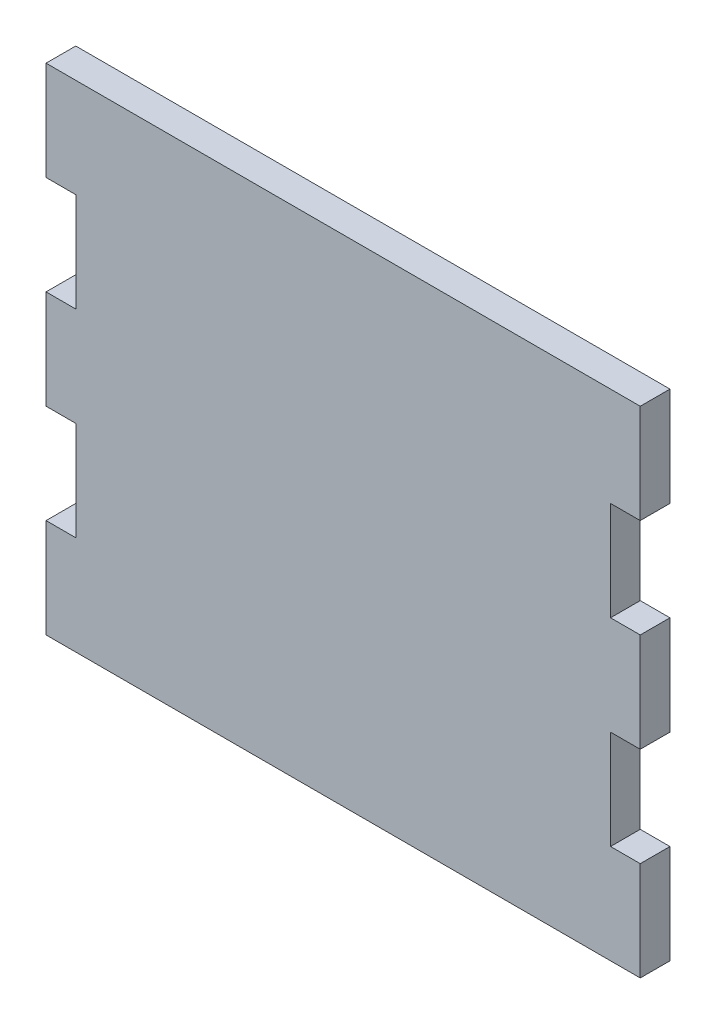
ISO-10303-21;
HEADER;
FILE_DESCRIPTION(('STEP AP214'),'2;1');
FILE_NAME('part.step','',(''),(''),'','','');
FILE_SCHEMA(('AUTOMOTIVE_DESIGN { 1 0 10303 214 1 1 1 1 }'));
ENDSEC;
DATA;
#1=APPLICATION_CONTEXT('core data for automotive mechanical design processes');
#2=APPLICATION_PROTOCOL_DEFINITION('international standard','automotive_design',2000,#1);
#3=PRODUCT_CONTEXT('',#1,'mechanical');
#4=PRODUCT('Part','Part','',(#3));
#5=PRODUCT_RELATED_PRODUCT_CATEGORY('part','',(#4));
#6=PRODUCT_DEFINITION_FORMATION('','',#4);
#7=PRODUCT_DEFINITION_CONTEXT('part definition',#1,'design');
#8=PRODUCT_DEFINITION('design','',#6,#7);
#9=PRODUCT_DEFINITION_SHAPE('','',#8);
#10=(LENGTH_UNIT() NAMED_UNIT(*) SI_UNIT(.MILLI.,.METRE.));
#11=(NAMED_UNIT(*) PLANE_ANGLE_UNIT() SI_UNIT($,.RADIAN.));
#12=(NAMED_UNIT(*) SI_UNIT($,.STERADIAN.) SOLID_ANGLE_UNIT());
#13=UNCERTAINTY_MEASURE_WITH_UNIT(LENGTH_MEASURE(1.E-05),#10,'distance_accuracy_value','');
#14=(GEOMETRIC_REPRESENTATION_CONTEXT(3) GLOBAL_UNCERTAINTY_ASSIGNED_CONTEXT((#13)) GLOBAL_UNIT_ASSIGNED_CONTEXT((#10,
#11,#12)) REPRESENTATION_CONTEXT('',''));
#15=CARTESIAN_POINT('',(0.,0.,0.));
#16=DIRECTION('',(0.,0.,1.));
#17=DIRECTION('',(1.,0.,0.));
#18=AXIS2_PLACEMENT_3D('',#15,#16,#17);
#19=CARTESIAN_POINT('',(-30.,0.,3.));
#20=DIRECTION('',(-1.,0.,0.));
#21=DIRECTION('',(0.,0.,1.));
#22=AXIS2_PLACEMENT_3D('',#19,#20,#21);
#23=PLANE('',#22);
#24=DIRECTION('',(0.,1.,0.));
#25=VECTOR('',#24,1.);
#26=CARTESIAN_POINT('',(-30.,0.,0.));
#27=LINE('',#26,#25);
#28=CARTESIAN_POINT('',(-30.,9.99999999999998,0.));
#29=VERTEX_POINT('',#28);
#30=CARTESIAN_POINT('',(-30.,20.,0.));
#31=VERTEX_POINT('',#30);
#32=EDGE_CURVE('E201',#29,#31,#27,.T.);
#33=ORIENTED_EDGE('',*,*,#32,.F.);
#34=DIRECTION('',(0.,0.,-1.));
#35=VECTOR('',#34,1.);
#36=CARTESIAN_POINT('',(-30.,9.99999999999998,3.));
#37=LINE('',#36,#35);
#38=CARTESIAN_POINT('',(-30.,9.99999999999998,3.));
#39=VERTEX_POINT('',#38);
#40=EDGE_CURVE('E11',#39,#29,#37,.T.);
#41=ORIENTED_EDGE('',*,*,#40,.F.);
#42=DIRECTION('',(0.,1.,0.));
#43=VECTOR('',#42,1.);
#44=CARTESIAN_POINT('',(-30.,0.,3.));
#45=LINE('',#44,#43);
#46=CARTESIAN_POINT('',(-30.,20.,3.));
#47=VERTEX_POINT('',#46);
#48=EDGE_CURVE('E247',#39,#47,#45,.T.);
#49=ORIENTED_EDGE('',*,*,#48,.T.);
#50=DIRECTION('',(0.,0.,-1.));
#51=VECTOR('',#50,1.);
#52=CARTESIAN_POINT('',(-30.,20.,3.));
#53=LINE('',#52,#51);
#54=EDGE_CURVE('E52',#47,#31,#53,.T.);
#55=ORIENTED_EDGE('',*,*,#54,.T.);
#56=EDGE_LOOP('',(#33,#41,#49,#55));
#57=FACE_BOUND('',#56,.T.);
#58=ADVANCED_FACE('F35',(#57),#23,.T.);
#59=CARTESIAN_POINT('',(0.,9.99999999999998,3.));
#60=DIRECTION('',(0.,1.,0.));
#61=DIRECTION('',(0.,0.,1.));
#62=AXIS2_PLACEMENT_3D('',#59,#60,#61);
#63=PLANE('',#62);
#64=DIRECTION('',(1.,0.,0.));
#65=VECTOR('',#64,1.);
#66=CARTESIAN_POINT('',(0.,9.99999999999998,0.));
#67=LINE('',#66,#65);
#68=CARTESIAN_POINT('',(-27.,9.99999999999998,0.));
#69=VERTEX_POINT('',#68);
#70=EDGE_CURVE('E203',#29,#69,#67,.T.);
#71=ORIENTED_EDGE('',*,*,#70,.T.);
#72=DIRECTION('',(0.,0.,-1.));
#73=VECTOR('',#72,1.);
#74=CARTESIAN_POINT('',(-27.,9.99999999999998,3.));
#75=LINE('',#74,#73);
#76=CARTESIAN_POINT('',(-27.,9.99999999999998,3.));
#77=VERTEX_POINT('',#76);
#78=EDGE_CURVE('E44',#77,#69,#75,.T.);
#79=ORIENTED_EDGE('',*,*,#78,.F.);
#80=DIRECTION('',(1.,0.,0.));
#81=VECTOR('',#80,1.);
#82=CARTESIAN_POINT('',(0.,9.99999999999998,3.));
#83=LINE('',#82,#81);
#84=EDGE_CURVE('E310',#39,#77,#83,.T.);
#85=ORIENTED_EDGE('',*,*,#84,.F.);
#86=ORIENTED_EDGE('',*,*,#40,.T.);
#87=EDGE_LOOP('',(#71,#79,#85,#86));
#88=FACE_BOUND('',#87,.T.);
#89=ADVANCED_FACE('F37',(#88),#63,.F.);
#90=CARTESIAN_POINT('',(-27.,0.,3.));
#91=DIRECTION('',(1.,0.,0.));
#92=DIRECTION('',(0.,1.,0.));
#93=AXIS2_PLACEMENT_3D('',#90,#91,#92);
#94=PLANE('',#93);
#95=DIRECTION('',(0.,-1.,0.));
#96=VECTOR('',#95,1.);
#97=CARTESIAN_POINT('',(-27.,0.,0.));
#98=LINE('',#97,#96);
#99=CARTESIAN_POINT('',(-27.,0.,0.));
#100=VERTEX_POINT('',#99);
#101=EDGE_CURVE('E207',#69,#100,#98,.T.);
#102=ORIENTED_EDGE('',*,*,#101,.T.);
#103=DIRECTION('',(0.,0.,-1.));
#104=VECTOR('',#103,1.);
#105=CARTESIAN_POINT('',(-27.,0.,3.));
#106=LINE('',#105,#104);
#107=CARTESIAN_POINT('',(-27.,0.,3.));
#108=VERTEX_POINT('',#107);
#109=EDGE_CURVE('E281',#108,#100,#106,.T.);
#110=ORIENTED_EDGE('',*,*,#109,.F.);
#111=DIRECTION('',(0.,-1.,0.));
#112=VECTOR('',#111,1.);
#113=CARTESIAN_POINT('',(-27.,0.,3.));
#114=LINE('',#113,#112);
#115=EDGE_CURVE('E289',#77,#108,#114,.T.);
#116=ORIENTED_EDGE('',*,*,#115,.F.);
#117=ORIENTED_EDGE('',*,*,#78,.T.);
#118=EDGE_LOOP('',(#102,#110,#116,#117));
#119=FACE_BOUND('',#118,.T.);
#120=ADVANCED_FACE('F287',(#119),#94,.F.);
#121=CARTESIAN_POINT('',(0.,0.,3.));
#122=DIRECTION('',(0.,1.,0.));
#123=DIRECTION('',(0.,0.,1.));
#124=AXIS2_PLACEMENT_3D('',#121,#122,#123);
#125=PLANE('',#124);
#126=DIRECTION('',(1.,0.,0.));
#127=VECTOR('',#126,1.);
#128=CARTESIAN_POINT('',(0.,0.,0.));
#129=LINE('',#128,#127);
#130=CARTESIAN_POINT('',(-30.,0.,0.));
#131=VERTEX_POINT('',#130);
#132=EDGE_CURVE('E210',#131,#100,#129,.T.);
#133=ORIENTED_EDGE('',*,*,#132,.F.);
#134=DIRECTION('',(0.,0.,-1.));
#135=VECTOR('',#134,1.);
#136=CARTESIAN_POINT('',(-30.,0.,3.));
#137=LINE('',#136,#135);
#138=CARTESIAN_POINT('',(-30.,0.,3.));
#139=VERTEX_POINT('',#138);
#140=EDGE_CURVE('E279',#139,#131,#137,.T.);
#141=ORIENTED_EDGE('',*,*,#140,.F.);
#142=DIRECTION('',(1.,0.,0.));
#143=VECTOR('',#142,1.);
#144=CARTESIAN_POINT('',(0.,0.,3.));
#145=LINE('',#144,#143);
#146=EDGE_CURVE('E302',#139,#108,#145,.T.);
#147=ORIENTED_EDGE('',*,*,#146,.T.);
#148=ORIENTED_EDGE('',*,*,#109,.T.);
#149=EDGE_LOOP('',(#133,#141,#147,#148));
#150=FACE_BOUND('',#149,.T.);
#151=ADVANCED_FACE('F299',(#150),#125,.T.);
#152=CARTESIAN_POINT('',(-30.,-10.,0.));
#153=VERTEX_POINT('',#152);
#154=EDGE_CURVE('E205',#153,#131,#27,.T.);
#155=ORIENTED_EDGE('',*,*,#154,.F.);
#156=DIRECTION('',(0.,0.,-1.));
#157=VECTOR('',#156,1.);
#158=CARTESIAN_POINT('',(-30.,-10.,3.));
#159=LINE('',#158,#157);
#160=CARTESIAN_POINT('',(-30.,-10.,3.));
#161=VERTEX_POINT('',#160);
#162=EDGE_CURVE('E277',#161,#153,#159,.T.);
#163=ORIENTED_EDGE('',*,*,#162,.F.);
#164=EDGE_CURVE('E305',#161,#139,#45,.T.);
#165=ORIENTED_EDGE('',*,*,#164,.T.);
#166=ORIENTED_EDGE('',*,*,#140,.T.);
#167=EDGE_LOOP('',(#155,#163,#165,#166));
#168=FACE_BOUND('',#167,.T.);
#169=ADVANCED_FACE('F351',(#168),#23,.T.);
#170=CARTESIAN_POINT('',(0.,-10.,3.));
#171=DIRECTION('',(0.,1.,0.));
#172=DIRECTION('',(-1.,0.,0.));
#173=AXIS2_PLACEMENT_3D('',#170,#171,#172);
#174=PLANE('',#173);
#175=DIRECTION('',(1.,0.,0.));
#176=VECTOR('',#175,1.);
#177=CARTESIAN_POINT('',(0.,-10.,0.));
#178=LINE('',#177,#176);
#179=CARTESIAN_POINT('',(-27.,-10.,0.));
#180=VERTEX_POINT('',#179);
#181=EDGE_CURVE('E213',#153,#180,#178,.T.);
#182=ORIENTED_EDGE('',*,*,#181,.T.);
#183=DIRECTION('',(0.,0.,-1.));
#184=VECTOR('',#183,1.);
#185=CARTESIAN_POINT('',(-27.,-10.,3.));
#186=LINE('',#185,#184);
#187=CARTESIAN_POINT('',(-27.,-10.,3.));
#188=VERTEX_POINT('',#187);
#189=EDGE_CURVE('E274',#188,#180,#186,.T.);
#190=ORIENTED_EDGE('',*,*,#189,.F.);
#191=DIRECTION('',(1.,0.,0.));
#192=VECTOR('',#191,1.);
#193=CARTESIAN_POINT('',(0.,-10.,3.));
#194=LINE('',#193,#192);
#195=EDGE_CURVE('E307',#161,#188,#194,.T.);
#196=ORIENTED_EDGE('',*,*,#195,.F.);
#197=ORIENTED_EDGE('',*,*,#162,.T.);
#198=EDGE_LOOP('',(#182,#190,#196,#197));
#199=FACE_BOUND('',#198,.T.);
#200=ADVANCED_FACE('F359',(#199),#174,.F.);
#201=CARTESIAN_POINT('',(-27.,0.,3.));
#202=DIRECTION('',(1.,0.,0.));
#203=DIRECTION('',(0.,0.,-1.));
#204=AXIS2_PLACEMENT_3D('',#201,#202,#203);
#205=PLANE('',#204);
#206=DIRECTION('',(0.,-1.,0.));
#207=VECTOR('',#206,1.);
#208=CARTESIAN_POINT('',(-27.,0.,0.));
#209=LINE('',#208,#207);
#210=CARTESIAN_POINT('',(-27.,-20.,0.));
#211=VERTEX_POINT('',#210);
#212=EDGE_CURVE('E215',#180,#211,#209,.T.);
#213=ORIENTED_EDGE('',*,*,#212,.T.);
#214=DIRECTION('',(0.,0.,-1.));
#215=VECTOR('',#214,1.);
#216=CARTESIAN_POINT('',(-27.,-20.,3.));
#217=LINE('',#216,#215);
#218=CARTESIAN_POINT('',(-27.,-20.,3.));
#219=VERTEX_POINT('',#218);
#220=EDGE_CURVE('E272',#219,#211,#217,.T.);
#221=ORIENTED_EDGE('',*,*,#220,.F.);
#222=DIRECTION('',(0.,-1.,0.));
#223=VECTOR('',#222,1.);
#224=CARTESIAN_POINT('',(-27.,0.,3.));
#225=LINE('',#224,#223);
#226=EDGE_CURVE('E315',#188,#219,#225,.T.);
#227=ORIENTED_EDGE('',*,*,#226,.F.);
#228=ORIENTED_EDGE('',*,*,#189,.T.);
#229=EDGE_LOOP('',(#213,#221,#227,#228));
#230=FACE_BOUND('',#229,.T.);
#231=ADVANCED_FACE('F371',(#230),#205,.F.);
#232=CARTESIAN_POINT('',(0.,-20.,3.));
#233=DIRECTION('',(0.,1.,0.));
#234=DIRECTION('',(0.,0.,1.));
#235=AXIS2_PLACEMENT_3D('',#232,#233,#234);
#236=PLANE('',#235);
#237=DIRECTION('',(1.,0.,0.));
#238=VECTOR('',#237,1.);
#239=CARTESIAN_POINT('',(0.,-20.,0.));
#240=LINE('',#239,#238);
#241=CARTESIAN_POINT('',(-30.,-20.,0.));
#242=VERTEX_POINT('',#241);
#243=EDGE_CURVE('E218',#242,#211,#240,.T.);
#244=ORIENTED_EDGE('',*,*,#243,.F.);
#245=DIRECTION('',(0.,0.,-1.));
#246=VECTOR('',#245,1.);
#247=CARTESIAN_POINT('',(-30.,-20.,3.));
#248=LINE('',#247,#246);
#249=CARTESIAN_POINT('',(-30.,-20.,3.));
#250=VERTEX_POINT('',#249);
#251=EDGE_CURVE('E270',#250,#242,#248,.T.);
#252=ORIENTED_EDGE('',*,*,#251,.F.);
#253=DIRECTION('',(1.,0.,0.));
#254=VECTOR('',#253,1.);
#255=CARTESIAN_POINT('',(0.,-20.,3.));
#256=LINE('',#255,#254);
#257=EDGE_CURVE('E317',#250,#219,#256,.T.);
#258=ORIENTED_EDGE('',*,*,#257,.T.);
#259=ORIENTED_EDGE('',*,*,#220,.T.);
#260=EDGE_LOOP('',(#244,#252,#258,#259));
#261=FACE_BOUND('',#260,.T.);
#262=ADVANCED_FACE('F363',(#261),#236,.T.);
#263=CARTESIAN_POINT('',(-30.,-30.,0.));
#264=VERTEX_POINT('',#263);
#265=EDGE_CURVE('E204',#264,#242,#27,.T.);
#266=ORIENTED_EDGE('',*,*,#265,.F.);
#267=DIRECTION('',(0.,0.,-1.));
#268=VECTOR('',#267,1.);
#269=CARTESIAN_POINT('',(-30.,-30.,3.));
#270=LINE('',#269,#268);
#271=CARTESIAN_POINT('',(-30.,-30.,3.));
#272=VERTEX_POINT('',#271);
#273=EDGE_CURVE('E268',#272,#264,#270,.T.);
#274=ORIENTED_EDGE('',*,*,#273,.F.);
#275=EDGE_CURVE('E309',#272,#250,#45,.T.);
#276=ORIENTED_EDGE('',*,*,#275,.T.);
#277=ORIENTED_EDGE('',*,*,#251,.T.);
#278=EDGE_LOOP('',(#266,#274,#276,#277));
#279=FACE_BOUND('',#278,.T.);
#280=ADVANCED_FACE('F352',(#279),#23,.T.);
#281=CARTESIAN_POINT('',(0.,-30.,3.));
#282=DIRECTION('',(0.,1.,0.));
#283=DIRECTION('',(0.,0.,1.));
#284=AXIS2_PLACEMENT_3D('',#281,#282,#283);
#285=PLANE('',#284);
#286=DIRECTION('',(1.,0.,0.));
#287=VECTOR('',#286,1.);
#288=CARTESIAN_POINT('',(0.,-30.,0.));
#289=LINE('',#288,#287);
#290=CARTESIAN_POINT('',(30.,-30.,0.));
#291=VERTEX_POINT('',#290);
#292=EDGE_CURVE('E221',#264,#291,#289,.T.);
#293=ORIENTED_EDGE('',*,*,#292,.T.);
#294=DIRECTION('',(0.,0.,-1.));
#295=VECTOR('',#294,1.);
#296=CARTESIAN_POINT('',(30.,-30.,3.));
#297=LINE('',#296,#295);
#298=CARTESIAN_POINT('',(30.,-30.,3.));
#299=VERTEX_POINT('',#298);
#300=EDGE_CURVE('E265',#299,#291,#297,.T.);
#301=ORIENTED_EDGE('',*,*,#300,.F.);
#302=DIRECTION('',(1.,0.,0.));
#303=VECTOR('',#302,1.);
#304=CARTESIAN_POINT('',(0.,-30.,3.));
#305=LINE('',#304,#303);
#306=EDGE_CURVE('E320',#272,#299,#305,.T.);
#307=ORIENTED_EDGE('',*,*,#306,.F.);
#308=ORIENTED_EDGE('',*,*,#273,.T.);
#309=EDGE_LOOP('',(#293,#301,#307,#308));
#310=FACE_BOUND('',#309,.T.);
#311=ADVANCED_FACE('F362',(#310),#285,.F.);
#312=CARTESIAN_POINT('',(30.,0.,3.));
#313=DIRECTION('',(-1.,0.,0.));
#314=DIRECTION('',(0.,0.,1.));
#315=AXIS2_PLACEMENT_3D('',#312,#313,#314);
#316=PLANE('',#315);
#317=DIRECTION('',(0.,1.,0.));
#318=VECTOR('',#317,1.);
#319=CARTESIAN_POINT('',(30.,0.,0.));
#320=LINE('',#319,#318);
#321=CARTESIAN_POINT('',(30.,-20.,0.));
#322=VERTEX_POINT('',#321);
#323=EDGE_CURVE('E223',#291,#322,#320,.T.);
#324=ORIENTED_EDGE('',*,*,#323,.T.);
#325=DIRECTION('',(0.,0.,-1.));
#326=VECTOR('',#325,1.);
#327=CARTESIAN_POINT('',(30.,-20.,3.));
#328=LINE('',#327,#326);
#329=CARTESIAN_POINT('',(30.,-20.,3.));
#330=VERTEX_POINT('',#329);
#331=EDGE_CURVE('E262',#330,#322,#328,.T.);
#332=ORIENTED_EDGE('',*,*,#331,.F.);
#333=DIRECTION('',(0.,1.,0.));
#334=VECTOR('',#333,1.);
#335=CARTESIAN_POINT('',(30.,0.,3.));
#336=LINE('',#335,#334);
#337=EDGE_CURVE('E322',#299,#330,#336,.T.);
#338=ORIENTED_EDGE('',*,*,#337,.F.);
#339=ORIENTED_EDGE('',*,*,#300,.T.);
#340=EDGE_LOOP('',(#324,#332,#338,#339));
#341=FACE_BOUND('',#340,.T.);
#342=ADVANCED_FACE('F369',(#341),#316,.F.);
#343=CARTESIAN_POINT('',(0.,-20.,3.));
#344=DIRECTION('',(0.,-1.,0.));
#345=DIRECTION('',(0.,0.,-1.));
#346=AXIS2_PLACEMENT_3D('',#343,#344,#345);
#347=PLANE('',#346);
#348=DIRECTION('',(-1.,0.,0.));
#349=VECTOR('',#348,1.);
#350=CARTESIAN_POINT('',(0.,-20.,0.));
#351=LINE('',#350,#349);
#352=CARTESIAN_POINT('',(27.,-20.,0.));
#353=VERTEX_POINT('',#352);
#354=EDGE_CURVE('E225',#322,#353,#351,.T.);
#355=ORIENTED_EDGE('',*,*,#354,.T.);
#356=DIRECTION('',(0.,0.,-1.));
#357=VECTOR('',#356,1.);
#358=CARTESIAN_POINT('',(27.,-20.,3.));
#359=LINE('',#358,#357);
#360=CARTESIAN_POINT('',(27.,-20.,3.));
#361=VERTEX_POINT('',#360);
#362=EDGE_CURVE('E260',#361,#353,#359,.T.);
#363=ORIENTED_EDGE('',*,*,#362,.F.);
#364=DIRECTION('',(-1.,0.,0.));
#365=VECTOR('',#364,1.);
#366=CARTESIAN_POINT('',(0.,-20.,3.));
#367=LINE('',#366,#365);
#368=EDGE_CURVE('E324',#330,#361,#367,.T.);
#369=ORIENTED_EDGE('',*,*,#368,.F.);
#370=ORIENTED_EDGE('',*,*,#331,.T.);
#371=EDGE_LOOP('',(#355,#363,#369,#370));
#372=FACE_BOUND('',#371,.T.);
#373=ADVANCED_FACE('F455',(#372),#347,.F.);
#374=CARTESIAN_POINT('',(27.,0.,3.));
#375=DIRECTION('',(1.,0.,0.));
#376=DIRECTION('',(0.,0.,-1.));
#377=AXIS2_PLACEMENT_3D('',#374,#375,#376);
#378=PLANE('',#377);
#379=DIRECTION('',(0.,-1.,0.));
#380=VECTOR('',#379,1.);
#381=CARTESIAN_POINT('',(27.,0.,0.));
#382=LINE('',#381,#380);
#383=CARTESIAN_POINT('',(27.,-10.,0.));
#384=VERTEX_POINT('',#383);
#385=EDGE_CURVE('E229',#384,#353,#382,.T.);
#386=ORIENTED_EDGE('',*,*,#385,.F.);
#387=DIRECTION('',(0.,0.,-1.));
#388=VECTOR('',#387,1.);
#389=CARTESIAN_POINT('',(27.,-10.,3.));
#390=LINE('',#389,#388);
#391=CARTESIAN_POINT('',(27.,-10.,3.));
#392=VERTEX_POINT('',#391);
#393=EDGE_CURVE('E258',#392,#384,#390,.T.);
#394=ORIENTED_EDGE('',*,*,#393,.F.);
#395=DIRECTION('',(0.,-1.,0.));
#396=VECTOR('',#395,1.);
#397=CARTESIAN_POINT('',(27.,0.,3.));
#398=LINE('',#397,#396);
#399=EDGE_CURVE('E327',#392,#361,#398,.T.);
#400=ORIENTED_EDGE('',*,*,#399,.T.);
#401=ORIENTED_EDGE('',*,*,#362,.T.);
#402=EDGE_LOOP('',(#386,#394,#400,#401));
#403=FACE_BOUND('',#402,.T.);
#404=ADVANCED_FACE('F465',(#403),#378,.T.);
#405=CARTESIAN_POINT('',(0.,-10.,3.));
#406=DIRECTION('',(0.,-1.,0.));
#407=DIRECTION('',(1.,0.,0.));
#408=AXIS2_PLACEMENT_3D('',#405,#406,#407);
#409=PLANE('',#408);
#410=DIRECTION('',(-1.,0.,0.));
#411=VECTOR('',#410,1.);
#412=CARTESIAN_POINT('',(0.,-10.,0.));
#413=LINE('',#412,#411);
#414=CARTESIAN_POINT('',(30.,-10.,0.));
#415=VERTEX_POINT('',#414);
#416=EDGE_CURVE('E232',#415,#384,#413,.T.);
#417=ORIENTED_EDGE('',*,*,#416,.F.);
#418=DIRECTION('',(0.,0.,-1.));
#419=VECTOR('',#418,1.);
#420=CARTESIAN_POINT('',(30.,-10.,3.));
#421=LINE('',#420,#419);
#422=CARTESIAN_POINT('',(30.,-10.,3.));
#423=VERTEX_POINT('',#422);
#424=EDGE_CURVE('E256',#423,#415,#421,.T.);
#425=ORIENTED_EDGE('',*,*,#424,.F.);
#426=DIRECTION('',(-1.,0.,0.));
#427=VECTOR('',#426,1.);
#428=CARTESIAN_POINT('',(0.,-10.,3.));
#429=LINE('',#428,#427);
#430=EDGE_CURVE('E330',#423,#392,#429,.T.);
#431=ORIENTED_EDGE('',*,*,#430,.T.);
#432=ORIENTED_EDGE('',*,*,#393,.T.);
#433=EDGE_LOOP('',(#417,#425,#431,#432));
#434=FACE_BOUND('',#433,.T.);
#435=ADVANCED_FACE('F475',(#434),#409,.T.);
#436=CARTESIAN_POINT('',(30.,0.,0.));
#437=VERTEX_POINT('',#436);
#438=EDGE_CURVE('E226',#415,#437,#320,.T.);
#439=ORIENTED_EDGE('',*,*,#438,.T.);
#440=DIRECTION('',(0.,0.,-1.));
#441=VECTOR('',#440,1.);
#442=CARTESIAN_POINT('',(30.,0.,3.));
#443=LINE('',#442,#441);
#444=CARTESIAN_POINT('',(30.,0.,3.));
#445=VERTEX_POINT('',#444);
#446=EDGE_CURVE('E253',#445,#437,#443,.T.);
#447=ORIENTED_EDGE('',*,*,#446,.F.);
#448=EDGE_CURVE('E325',#423,#445,#336,.T.);
#449=ORIENTED_EDGE('',*,*,#448,.F.);
#450=ORIENTED_EDGE('',*,*,#424,.T.);
#451=EDGE_LOOP('',(#439,#447,#449,#450));
#452=FACE_BOUND('',#451,.T.);
#453=ADVANCED_FACE('F457',(#452),#316,.F.);
#454=CARTESIAN_POINT('',(0.,0.,3.));
#455=DIRECTION('',(0.,-1.,0.));
#456=DIRECTION('',(0.,0.,-1.));
#457=AXIS2_PLACEMENT_3D('',#454,#455,#456);
#458=PLANE('',#457);
#459=DIRECTION('',(-1.,0.,0.));
#460=VECTOR('',#459,1.);
#461=CARTESIAN_POINT('',(0.,0.,0.));
#462=LINE('',#461,#460);
#463=CARTESIAN_POINT('',(27.,0.,0.));
#464=VERTEX_POINT('',#463);
#465=EDGE_CURVE('E235',#437,#464,#462,.T.);
#466=ORIENTED_EDGE('',*,*,#465,.T.);
#467=DIRECTION('',(0.,0.,-1.));
#468=VECTOR('',#467,1.);
#469=CARTESIAN_POINT('',(27.,0.,3.));
#470=LINE('',#469,#468);
#471=CARTESIAN_POINT('',(27.,0.,3.));
#472=VERTEX_POINT('',#471);
#473=EDGE_CURVE('E251',#472,#464,#470,.T.);
#474=ORIENTED_EDGE('',*,*,#473,.F.);
#475=DIRECTION('',(-1.,0.,0.));
#476=VECTOR('',#475,1.);
#477=CARTESIAN_POINT('',(0.,0.,3.));
#478=LINE('',#477,#476);
#479=EDGE_CURVE('E333',#445,#472,#478,.T.);
#480=ORIENTED_EDGE('',*,*,#479,.F.);
#481=ORIENTED_EDGE('',*,*,#446,.T.);
#482=EDGE_LOOP('',(#466,#474,#480,#481));
#483=FACE_BOUND('',#482,.T.);
#484=ADVANCED_FACE('F495',(#483),#458,.F.);
#485=CARTESIAN_POINT('',(27.,0.,3.));
#486=DIRECTION('',(1.,0.,0.));
#487=DIRECTION('',(0.,1.,0.));
#488=AXIS2_PLACEMENT_3D('',#485,#486,#487);
#489=PLANE('',#488);
#490=DIRECTION('',(0.,-1.,0.));
#491=VECTOR('',#490,1.);
#492=CARTESIAN_POINT('',(27.,0.,0.));
#493=LINE('',#492,#491);
#494=CARTESIAN_POINT('',(27.,9.99999999999998,0.));
#495=VERTEX_POINT('',#494);
#496=EDGE_CURVE('E238',#495,#464,#493,.T.);
#497=ORIENTED_EDGE('',*,*,#496,.F.);
#498=DIRECTION('',(0.,0.,-1.));
#499=VECTOR('',#498,1.);
#500=CARTESIAN_POINT('',(27.,9.99999999999998,3.));
#501=LINE('',#500,#499);
#502=CARTESIAN_POINT('',(27.,9.99999999999998,3.));
#503=VERTEX_POINT('',#502);
#504=EDGE_CURVE('E183',#503,#495,#501,.T.);
#505=ORIENTED_EDGE('',*,*,#504,.F.);
#506=DIRECTION('',(0.,-1.,0.));
#507=VECTOR('',#506,1.);
#508=CARTESIAN_POINT('',(27.,0.,3.));
#509=LINE('',#508,#507);
#510=EDGE_CURVE('E193',#503,#472,#509,.T.);
#511=ORIENTED_EDGE('',*,*,#510,.T.);
#512=ORIENTED_EDGE('',*,*,#473,.T.);
#513=EDGE_LOOP('',(#497,#505,#511,#512));
#514=FACE_BOUND('',#513,.T.);
#515=ADVANCED_FACE('F336',(#514),#489,.T.);
#516=CARTESIAN_POINT('',(0.,9.99999999999998,3.));
#517=DIRECTION('',(0.,-1.,0.));
#518=DIRECTION('',(0.,0.,-1.));
#519=AXIS2_PLACEMENT_3D('',#516,#517,#518);
#520=PLANE('',#519);
#521=DIRECTION('',(-1.,0.,0.));
#522=VECTOR('',#521,1.);
#523=CARTESIAN_POINT('',(0.,9.99999999999998,0.));
#524=LINE('',#523,#522);
#525=CARTESIAN_POINT('',(30.,9.99999999999998,0.));
#526=VERTEX_POINT('',#525);
#527=EDGE_CURVE('E179',#526,#495,#524,.T.);
#528=ORIENTED_EDGE('',*,*,#527,.F.);
#529=DIRECTION('',(0.,0.,-1.));
#530=VECTOR('',#529,1.);
#531=CARTESIAN_POINT('',(30.,9.99999999999998,3.));
#532=LINE('',#531,#530);
#533=CARTESIAN_POINT('',(30.,9.99999999999998,3.));
#534=VERTEX_POINT('',#533);
#535=EDGE_CURVE('E174',#534,#526,#532,.T.);
#536=ORIENTED_EDGE('',*,*,#535,.F.);
#537=DIRECTION('',(-1.,0.,0.));
#538=VECTOR('',#537,1.);
#539=CARTESIAN_POINT('',(0.,9.99999999999998,3.));
#540=LINE('',#539,#538);
#541=EDGE_CURVE('E177',#534,#503,#540,.T.);
#542=ORIENTED_EDGE('',*,*,#541,.T.);
#543=ORIENTED_EDGE('',*,*,#504,.T.);
#544=EDGE_LOOP('',(#528,#536,#542,#543));
#545=FACE_BOUND('',#544,.T.);
#546=ADVANCED_FACE('F176',(#545),#520,.T.);
#547=CARTESIAN_POINT('',(30.,0.,3.));
#548=DIRECTION('',(1.,0.,0.));
#549=DIRECTION('',(0.,1.,0.));
#550=AXIS2_PLACEMENT_3D('',#547,#548,#549);
#551=PLANE('',#550);
#552=DIRECTION('',(0.,-1.,0.));
#553=VECTOR('',#552,1.);
#554=CARTESIAN_POINT('',(30.,0.,0.));
#555=LINE('',#554,#553);
#556=CARTESIAN_POINT('',(30.,20.,0.));
#557=VERTEX_POINT('',#556);
#558=EDGE_CURVE('E242',#557,#526,#555,.T.);
#559=ORIENTED_EDGE('',*,*,#558,.F.);
#560=DIRECTION('',(0.,0.,-1.));
#561=VECTOR('',#560,1.);
#562=CARTESIAN_POINT('',(30.,20.,3.));
#563=LINE('',#562,#561);
#564=CARTESIAN_POINT('',(30.,20.,3.));
#565=VERTEX_POINT('',#564);
#566=EDGE_CURVE('E113',#565,#557,#563,.T.);
#567=ORIENTED_EDGE('',*,*,#566,.F.);
#568=DIRECTION('',(0.,-1.,0.));
#569=VECTOR('',#568,1.);
#570=CARTESIAN_POINT('',(30.,0.,3.));
#571=LINE('',#570,#569);
#572=EDGE_CURVE('E191',#565,#534,#571,.T.);
#573=ORIENTED_EDGE('',*,*,#572,.T.);
#574=ORIENTED_EDGE('',*,*,#535,.T.);
#575=EDGE_LOOP('',(#559,#567,#573,#574));
#576=FACE_BOUND('',#575,.T.);
#577=ADVANCED_FACE('F195',(#576),#551,.T.);
#578=CARTESIAN_POINT('',(0.,20.,3.));
#579=DIRECTION('',(0.,1.,0.));
#580=DIRECTION('',(-1.,0.,0.));
#581=AXIS2_PLACEMENT_3D('',#578,#579,#580);
#582=PLANE('',#581);
#583=DIRECTION('',(1.,0.,0.));
#584=VECTOR('',#583,1.);
#585=CARTESIAN_POINT('',(0.,20.,0.));
#586=LINE('',#585,#584);
#587=EDGE_CURVE('E244',#31,#557,#586,.T.);
#588=ORIENTED_EDGE('',*,*,#587,.F.);
#589=ORIENTED_EDGE('',*,*,#54,.F.);
#590=DIRECTION('',(1.,0.,0.));
#591=VECTOR('',#590,1.);
#592=CARTESIAN_POINT('',(0.,20.,3.));
#593=LINE('',#592,#591);
#594=EDGE_CURVE('E196',#47,#565,#593,.T.);
#595=ORIENTED_EDGE('',*,*,#594,.T.);
#596=ORIENTED_EDGE('',*,*,#566,.T.);
#597=EDGE_LOOP('',(#588,#589,#595,#596));
#598=FACE_BOUND('',#597,.T.);
#599=ADVANCED_FACE('F339',(#598),#582,.T.);
#600=CARTESIAN_POINT('',(0.,0.,3.));
#601=DIRECTION('',(0.,0.,1.));
#602=DIRECTION('',(1.,0.,0.));
#603=AXIS2_PLACEMENT_3D('',#600,#601,#602);
#604=PLANE('',#603);
#605=ORIENTED_EDGE('',*,*,#48,.F.);
#606=ORIENTED_EDGE('',*,*,#84,.T.);
#607=ORIENTED_EDGE('',*,*,#115,.T.);
#608=ORIENTED_EDGE('',*,*,#146,.F.);
#609=ORIENTED_EDGE('',*,*,#164,.F.);
#610=ORIENTED_EDGE('',*,*,#195,.T.);
#611=ORIENTED_EDGE('',*,*,#226,.T.);
#612=ORIENTED_EDGE('',*,*,#257,.F.);
#613=ORIENTED_EDGE('',*,*,#275,.F.);
#614=ORIENTED_EDGE('',*,*,#306,.T.);
#615=ORIENTED_EDGE('',*,*,#337,.T.);
#616=ORIENTED_EDGE('',*,*,#368,.T.);
#617=ORIENTED_EDGE('',*,*,#399,.F.);
#618=ORIENTED_EDGE('',*,*,#430,.F.);
#619=ORIENTED_EDGE('',*,*,#448,.T.);
#620=ORIENTED_EDGE('',*,*,#479,.T.);
#621=ORIENTED_EDGE('',*,*,#510,.F.);
#622=ORIENTED_EDGE('',*,*,#541,.F.);
#623=ORIENTED_EDGE('',*,*,#572,.F.);
#624=ORIENTED_EDGE('',*,*,#594,.F.);
#625=EDGE_LOOP('',(#605,#606,#607,#608,#609,#610,#611,#612,#613,#614,#615,#616,#617,#618,#619,
#620,#621,#622,#623,#624));
#626=FACE_BOUND('',#625,.T.);
#627=ADVANCED_FACE('F189',(#626),#604,.T.);
#628=CARTESIAN_POINT('',(0.,0.,0.));
#629=DIRECTION('',(0.,0.,1.));
#630=DIRECTION('',(1.,0.,0.));
#631=AXIS2_PLACEMENT_3D('',#628,#629,#630);
#632=PLANE('',#631);
#633=ORIENTED_EDGE('',*,*,#32,.T.);
#634=ORIENTED_EDGE('',*,*,#587,.T.);
#635=ORIENTED_EDGE('',*,*,#558,.T.);
#636=ORIENTED_EDGE('',*,*,#527,.T.);
#637=ORIENTED_EDGE('',*,*,#496,.T.);
#638=ORIENTED_EDGE('',*,*,#465,.F.);
#639=ORIENTED_EDGE('',*,*,#438,.F.);
#640=ORIENTED_EDGE('',*,*,#416,.T.);
#641=ORIENTED_EDGE('',*,*,#385,.T.);
#642=ORIENTED_EDGE('',*,*,#354,.F.);
#643=ORIENTED_EDGE('',*,*,#323,.F.);
#644=ORIENTED_EDGE('',*,*,#292,.F.);
#645=ORIENTED_EDGE('',*,*,#265,.T.);
#646=ORIENTED_EDGE('',*,*,#243,.T.);
#647=ORIENTED_EDGE('',*,*,#212,.F.);
#648=ORIENTED_EDGE('',*,*,#181,.F.);
#649=ORIENTED_EDGE('',*,*,#154,.T.);
#650=ORIENTED_EDGE('',*,*,#132,.T.);
#651=ORIENTED_EDGE('',*,*,#101,.F.);
#652=ORIENTED_EDGE('',*,*,#70,.F.);
#653=EDGE_LOOP('',(#633,#634,#635,#636,#637,#638,#639,#640,#641,#642,#643,#644,#645,#646,#647,
#648,#649,#650,#651,#652));
#654=FACE_BOUND('',#653,.T.);
#655=ADVANCED_FACE('F293',(#654),#632,.F.);
#656=CLOSED_SHELL('',(#58,#89,#120,#151,#169,#200,#231,#262,#280,#311,#342,#373,#404,#435,#453,
#484,#515,#546,#577,#599,#627,#655));
#657=MANIFOLD_SOLID_BREP('B2',#656);
#658=ADVANCED_BREP_SHAPE_REPRESENTATION('',(#18,#657),#14);
#659=SHAPE_DEFINITION_REPRESENTATION(#9,#658);
ENDSEC;
END-ISO-10303-21;
